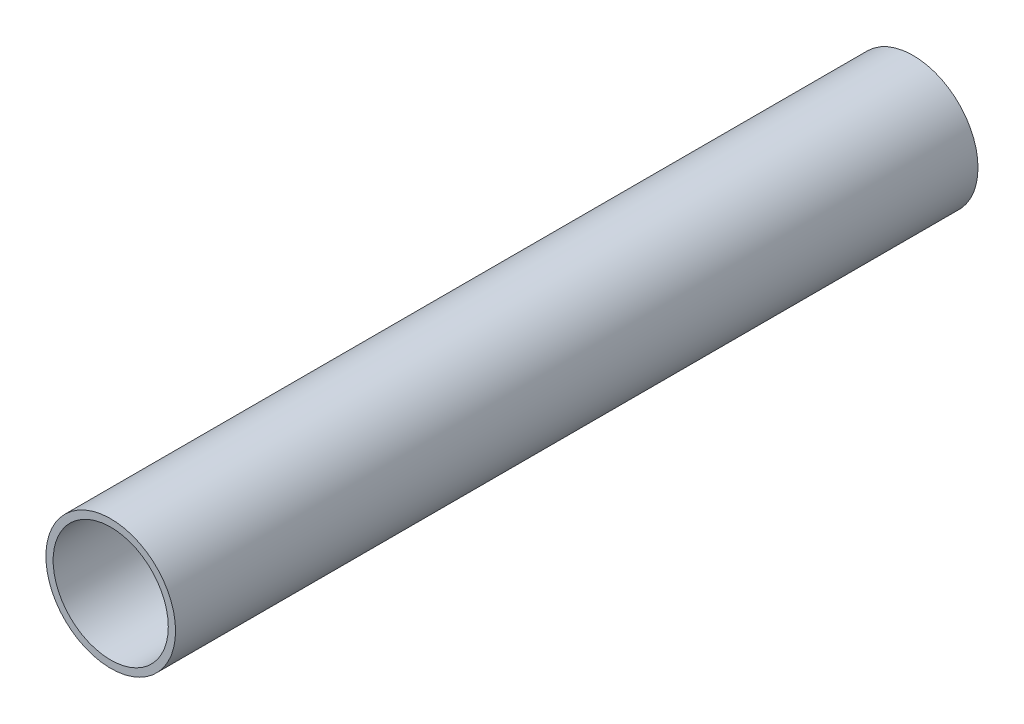
ISO-10303-21;
HEADER;
FILE_DESCRIPTION(('STEP AP214'),'2;1');
FILE_NAME('part.step','',(''),(''),'','','');
FILE_SCHEMA(('AUTOMOTIVE_DESIGN { 1 0 10303 214 1 1 1 1 }'));
ENDSEC;
DATA;
#1=APPLICATION_CONTEXT('core data for automotive mechanical design processes');
#2=APPLICATION_PROTOCOL_DEFINITION('international standard','automotive_design',2000,#1);
#3=PRODUCT_CONTEXT('',#1,'mechanical');
#4=PRODUCT('Part','Part','',(#3));
#5=PRODUCT_RELATED_PRODUCT_CATEGORY('part','',(#4));
#6=PRODUCT_DEFINITION_FORMATION('','',#4);
#7=PRODUCT_DEFINITION_CONTEXT('part definition',#1,'design');
#8=PRODUCT_DEFINITION('design','',#6,#7);
#9=PRODUCT_DEFINITION_SHAPE('','',#8);
#10=(LENGTH_UNIT() NAMED_UNIT(*) SI_UNIT(.MILLI.,.METRE.));
#11=(NAMED_UNIT(*) PLANE_ANGLE_UNIT() SI_UNIT($,.RADIAN.));
#12=(NAMED_UNIT(*) SI_UNIT($,.STERADIAN.) SOLID_ANGLE_UNIT());
#13=UNCERTAINTY_MEASURE_WITH_UNIT(LENGTH_MEASURE(1.E-05),#10,'distance_accuracy_value','');
#14=(GEOMETRIC_REPRESENTATION_CONTEXT(3) GLOBAL_UNCERTAINTY_ASSIGNED_CONTEXT((#13)) GLOBAL_UNIT_ASSIGNED_CONTEXT((#10,
#11,#12)) REPRESENTATION_CONTEXT('',''));
#15=CARTESIAN_POINT('',(0.,0.,0.));
#16=DIRECTION('',(0.,0.,1.));
#17=DIRECTION('',(1.,0.,0.));
#18=AXIS2_PLACEMENT_3D('',#15,#16,#17);
#19=CARTESIAN_POINT('',(0.569423109943568,-0.711778887429459,98.24));
#20=DIRECTION('',(0.,0.,1.));
#21=DIRECTION('',(1.,0.,0.));
#22=AXIS2_PLACEMENT_3D('',#19,#20,#21);
#23=PLANE('',#22);
#24=CARTESIAN_POINT('',(0.569423109943568,-0.711778887429459,98.24));
#25=DIRECTION('',(0.,0.,1.));
#26=DIRECTION('',(1.,0.,0.));
#27=AXIS2_PLACEMENT_3D('',#24,#25,#26);
#28=CIRCLE('',#27,7.9375);
#29=CARTESIAN_POINT('',(8.50692310994357,-0.711778887429459,98.24));
#30=VERTEX_POINT('',#29);
#31=EDGE_CURVE('E10',#30,#30,#28,.T.);
#32=ORIENTED_EDGE('',*,*,#31,.T.);
#33=EDGE_LOOP('',(#32));
#34=FACE_BOUND('',#33,.T.);
#35=CARTESIAN_POINT('',(0.569423109943568,-0.711778887429459,98.24));
#36=DIRECTION('',(0.,0.,1.));
#37=DIRECTION('',(1.,0.,0.));
#38=AXIS2_PLACEMENT_3D('',#35,#36,#37);
#39=CIRCLE('',#38,7.0485);
#40=CARTESIAN_POINT('',(7.61792310994357,-0.711778887429459,98.24));
#41=VERTEX_POINT('',#40);
#42=EDGE_CURVE('E44',#41,#41,#39,.T.);
#43=ORIENTED_EDGE('',*,*,#42,.F.);
#44=EDGE_LOOP('',(#43));
#45=FACE_BOUND('',#44,.T.);
#46=ADVANCED_FACE('F33',(#34,#45),#23,.T.);
#47=CARTESIAN_POINT('',(0.569423109943568,-0.711778887429459,0.));
#48=DIRECTION('',(0.,0.,1.));
#49=DIRECTION('',(1.,0.,0.));
#50=AXIS2_PLACEMENT_3D('',#47,#48,#49);
#51=PLANE('',#50);
#52=CARTESIAN_POINT('',(0.569423109943568,-0.711778887429459,0.));
#53=DIRECTION('',(0.,0.,1.));
#54=DIRECTION('',(1.,0.,0.));
#55=AXIS2_PLACEMENT_3D('',#52,#53,#54);
#56=CIRCLE('',#55,7.9375);
#57=CARTESIAN_POINT('',(8.50692310994357,-0.711778887429459,0.));
#58=VERTEX_POINT('',#57);
#59=EDGE_CURVE('E37',#58,#58,#56,.T.);
#60=ORIENTED_EDGE('',*,*,#59,.F.);
#61=EDGE_LOOP('',(#60));
#62=FACE_BOUND('',#61,.T.);
#63=CARTESIAN_POINT('',(0.569423109943568,-0.711778887429459,0.));
#64=DIRECTION('',(0.,0.,1.));
#65=DIRECTION('',(1.,0.,0.));
#66=AXIS2_PLACEMENT_3D('',#63,#64,#65);
#67=CIRCLE('',#66,7.0485);
#68=CARTESIAN_POINT('',(7.61792310994357,-0.711778887429459,0.));
#69=VERTEX_POINT('',#68);
#70=EDGE_CURVE('E46',#69,#69,#67,.T.);
#71=ORIENTED_EDGE('',*,*,#70,.T.);
#72=EDGE_LOOP('',(#71));
#73=FACE_BOUND('',#72,.T.);
#74=ADVANCED_FACE('F56',(#62,#73),#51,.F.);
#75=CARTESIAN_POINT('',(0.569423109943568,-0.711778887429459,98.24));
#76=DIRECTION('',(0.,0.,-1.));
#77=DIRECTION('',(-1.,0.,0.));
#78=AXIS2_PLACEMENT_3D('',#75,#76,#77);
#79=CYLINDRICAL_SURFACE('',#78,7.9375);
#80=ORIENTED_EDGE('',*,*,#31,.F.);
#81=EDGE_LOOP('',(#80));
#82=FACE_BOUND('',#81,.T.);
#83=ORIENTED_EDGE('',*,*,#59,.T.);
#84=EDGE_LOOP('',(#83));
#85=FACE_BOUND('',#84,.T.);
#86=ADVANCED_FACE('F35',(#82,#85),#79,.T.);
#87=CARTESIAN_POINT('',(0.569423109943568,-0.711778887429459,98.24));
#88=DIRECTION('',(0.,0.,-1.));
#89=DIRECTION('',(-1.,0.,0.));
#90=AXIS2_PLACEMENT_3D('',#87,#88,#89);
#91=CYLINDRICAL_SURFACE('',#90,7.0485);
#92=ORIENTED_EDGE('',*,*,#42,.T.);
#93=EDGE_LOOP('',(#92));
#94=FACE_BOUND('',#93,.T.);
#95=ORIENTED_EDGE('',*,*,#70,.F.);
#96=EDGE_LOOP('',(#95));
#97=FACE_BOUND('',#96,.T.);
#98=ADVANCED_FACE('F52',(#94,#97),#91,.F.);
#99=CLOSED_SHELL('',(#46,#74,#86,#98));
#100=MANIFOLD_SOLID_BREP('B2',#99);
#101=ADVANCED_BREP_SHAPE_REPRESENTATION('',(#18,#100),#14);
#102=SHAPE_DEFINITION_REPRESENTATION(#9,#101);
ENDSEC;
END-ISO-10303-21;
